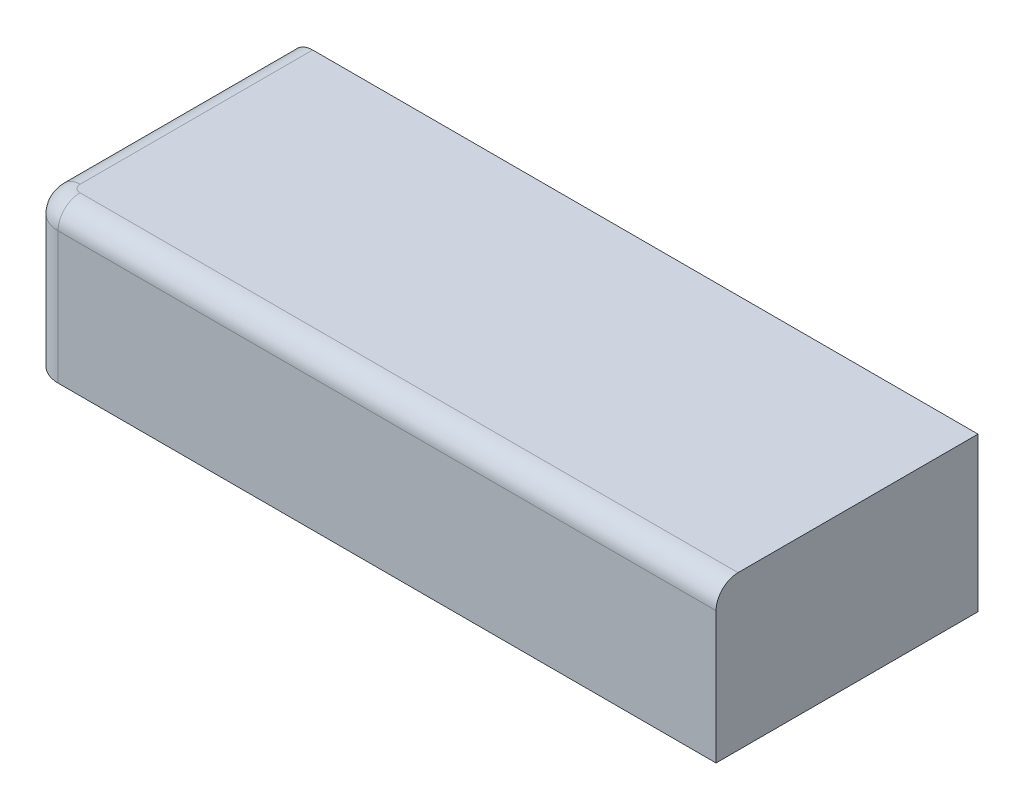
ISO-10303-21;
HEADER;
FILE_DESCRIPTION(('STEP AP214'),'2;1');
FILE_NAME('part.step','',(''),(''),'','','');
FILE_SCHEMA(('AUTOMOTIVE_DESIGN { 1 0 10303 214 1 1 1 1 }'));
ENDSEC;
DATA;
#1=APPLICATION_CONTEXT('core data for automotive mechanical design processes');
#2=APPLICATION_PROTOCOL_DEFINITION('international standard','automotive_design',2000,#1);
#3=PRODUCT_CONTEXT('',#1,'mechanical');
#4=PRODUCT('Part','Part','',(#3));
#5=PRODUCT_RELATED_PRODUCT_CATEGORY('part','',(#4));
#6=PRODUCT_DEFINITION_FORMATION('','',#4);
#7=PRODUCT_DEFINITION_CONTEXT('part definition',#1,'design');
#8=PRODUCT_DEFINITION('design','',#6,#7);
#9=PRODUCT_DEFINITION_SHAPE('','',#8);
#10=(LENGTH_UNIT() NAMED_UNIT(*) SI_UNIT(.MILLI.,.METRE.));
#11=(NAMED_UNIT(*) PLANE_ANGLE_UNIT() SI_UNIT($,.RADIAN.));
#12=(NAMED_UNIT(*) SI_UNIT($,.STERADIAN.) SOLID_ANGLE_UNIT());
#13=UNCERTAINTY_MEASURE_WITH_UNIT(LENGTH_MEASURE(1.E-05),#10,'distance_accuracy_value','');
#14=(GEOMETRIC_REPRESENTATION_CONTEXT(3) GLOBAL_UNCERTAINTY_ASSIGNED_CONTEXT((#13)) GLOBAL_UNIT_ASSIGNED_CONTEXT((#10,
#11,#12)) REPRESENTATION_CONTEXT('',''));
#15=CARTESIAN_POINT('',(0.,0.,0.));
#16=DIRECTION('',(0.,0.,1.));
#17=DIRECTION('',(1.,0.,0.));
#18=AXIS2_PLACEMENT_3D('',#15,#16,#17);
#19=CARTESIAN_POINT('',(46.9,21.,-17.875));
#20=DIRECTION('',(-1.,0.,0.));
#21=DIRECTION('',(0.,0.,1.));
#22=AXIS2_PLACEMENT_3D('',#19,#20,#21);
#23=PLANE('',#22);
#24=DIRECTION('',(0.,0.,-1.));
#25=VECTOR('',#24,1.);
#26=CARTESIAN_POINT('',(46.9,21.,-17.875));
#27=LINE('',#26,#25);
#28=CARTESIAN_POINT('',(46.9,21.,14.875));
#29=VERTEX_POINT('',#28);
#30=CARTESIAN_POINT('',(46.9,21.,-17.875));
#31=VERTEX_POINT('',#30);
#32=EDGE_CURVE('E102',#29,#31,#27,.T.);
#33=ORIENTED_EDGE('',*,*,#32,.F.);
#34=CARTESIAN_POINT('',(46.9,18.,14.875));
#35=DIRECTION('',(-1.,0.,0.));
#36=DIRECTION('',(0.,0.,1.));
#37=AXIS2_PLACEMENT_3D('',#34,#35,#36);
#38=CIRCLE('',#37,3.);
#39=CARTESIAN_POINT('',(46.9,18.,17.875));
#40=VERTEX_POINT('',#39);
#41=EDGE_CURVE('E67',#29,#40,#38,.F.);
#42=ORIENTED_EDGE('',*,*,#41,.T.);
#43=DIRECTION('',(0.,-1.,0.));
#44=VECTOR('',#43,1.);
#45=CARTESIAN_POINT('',(46.9,21.,17.875));
#46=LINE('',#45,#44);
#47=CARTESIAN_POINT('',(46.9,0.,17.875));
#48=VERTEX_POINT('',#47);
#49=EDGE_CURVE('E122',#40,#48,#46,.T.);
#50=ORIENTED_EDGE('',*,*,#49,.T.);
#51=DIRECTION('',(0.,0.,-1.));
#52=VECTOR('',#51,1.);
#53=CARTESIAN_POINT('',(46.9,0.,-17.875));
#54=LINE('',#53,#52);
#55=CARTESIAN_POINT('',(46.9,0.,-17.875));
#56=VERTEX_POINT('',#55);
#57=EDGE_CURVE('E125',#48,#56,#54,.T.);
#58=ORIENTED_EDGE('',*,*,#57,.T.);
#59=DIRECTION('',(0.,-1.,0.));
#60=VECTOR('',#59,1.);
#61=CARTESIAN_POINT('',(46.9,21.,-17.875));
#62=LINE('',#61,#60);
#63=EDGE_CURVE('E118',#31,#56,#62,.T.);
#64=ORIENTED_EDGE('',*,*,#63,.F.);
#65=EDGE_LOOP('',(#33,#42,#50,#58,#64));
#66=FACE_BOUND('',#65,.T.);
#67=ADVANCED_FACE('F43',(#66),#23,.F.);
#68=CARTESIAN_POINT('',(-46.9,21.,-17.875));
#69=DIRECTION('',(0.,0.,1.));
#70=DIRECTION('',(1.,0.,0.));
#71=AXIS2_PLACEMENT_3D('',#68,#69,#70);
#72=PLANE('',#71);
#73=DIRECTION('',(0.,-1.,0.));
#74=VECTOR('',#73,1.);
#75=CARTESIAN_POINT('',(-46.9,21.,-17.875));
#76=LINE('',#75,#74);
#77=CARTESIAN_POINT('',(-46.9,18.,-17.875));
#78=VERTEX_POINT('',#77);
#79=CARTESIAN_POINT('',(-46.9,0.,-17.875));
#80=VERTEX_POINT('',#79);
#81=EDGE_CURVE('E127',#78,#80,#76,.T.);
#82=ORIENTED_EDGE('',*,*,#81,.F.);
#83=CARTESIAN_POINT('',(-43.9,18.,-17.875));
#84=DIRECTION('',(0.,0.,1.));
#85=DIRECTION('',(1.,0.,0.));
#86=AXIS2_PLACEMENT_3D('',#83,#84,#85);
#87=CIRCLE('',#86,3.);
#88=CARTESIAN_POINT('',(-43.9,21.,-17.875));
#89=VERTEX_POINT('',#88);
#90=EDGE_CURVE('E121',#78,#89,#87,.F.);
#91=ORIENTED_EDGE('',*,*,#90,.T.);
#92=DIRECTION('',(-1.,0.,0.));
#93=VECTOR('',#92,1.);
#94=CARTESIAN_POINT('',(-46.9,21.,-17.875));
#95=LINE('',#94,#93);
#96=EDGE_CURVE('E106',#31,#89,#95,.T.);
#97=ORIENTED_EDGE('',*,*,#96,.F.);
#98=ORIENTED_EDGE('',*,*,#63,.T.);
#99=DIRECTION('',(-1.,0.,0.));
#100=VECTOR('',#99,1.);
#101=CARTESIAN_POINT('',(-46.9,0.,-17.875));
#102=LINE('',#101,#100);
#103=EDGE_CURVE('E150',#56,#80,#102,.T.);
#104=ORIENTED_EDGE('',*,*,#103,.T.);
#105=EDGE_LOOP('',(#82,#91,#97,#98,#104));
#106=FACE_BOUND('',#105,.T.);
#107=ADVANCED_FACE('F116',(#106),#72,.F.);
#108=CARTESIAN_POINT('',(-46.9,21.,-17.875));
#109=DIRECTION('',(1.,0.,0.));
#110=DIRECTION('',(0.,0.,-1.));
#111=AXIS2_PLACEMENT_3D('',#108,#109,#110);
#112=PLANE('',#111);
#113=DIRECTION('',(0.,-1.,0.));
#114=VECTOR('',#113,1.);
#115=CARTESIAN_POINT('',(-46.9,21.,13.875));
#116=LINE('',#115,#114);
#117=CARTESIAN_POINT('',(-46.9,18.,13.875));
#118=VERTEX_POINT('',#117);
#119=CARTESIAN_POINT('',(-46.9,0.,13.875));
#120=VERTEX_POINT('',#119);
#121=EDGE_CURVE('E130',#118,#120,#116,.T.);
#122=ORIENTED_EDGE('',*,*,#121,.F.);
#123=DIRECTION('',(0.,0.,1.));
#124=VECTOR('',#123,1.);
#125=CARTESIAN_POINT('',(-46.9,18.,-17.875));
#126=LINE('',#125,#124);
#127=EDGE_CURVE('E137',#118,#78,#126,.F.);
#128=ORIENTED_EDGE('',*,*,#127,.T.);
#129=ORIENTED_EDGE('',*,*,#81,.T.);
#130=DIRECTION('',(0.,0.,1.));
#131=VECTOR('',#130,1.);
#132=CARTESIAN_POINT('',(-46.9,0.,-17.875));
#133=LINE('',#132,#131);
#134=EDGE_CURVE('E152',#80,#120,#133,.T.);
#135=ORIENTED_EDGE('',*,*,#134,.T.);
#136=EDGE_LOOP('',(#122,#128,#129,#135));
#137=FACE_BOUND('',#136,.T.);
#138=ADVANCED_FACE('F171',(#137),#112,.F.);
#139=CARTESIAN_POINT('',(-42.9,21.,13.875));
#140=DIRECTION('',(0.,-1.,0.));
#141=DIRECTION('',(0.,0.,-1.));
#142=AXIS2_PLACEMENT_3D('',#139,#140,#141);
#143=CYLINDRICAL_SURFACE('',#142,4.);
#144=DIRECTION('',(0.,-1.,0.));
#145=VECTOR('',#144,1.);
#146=CARTESIAN_POINT('',(-42.8999999999999,21.,17.875));
#147=LINE('',#146,#145);
#148=CARTESIAN_POINT('',(-42.8999999999999,18.,17.875));
#149=VERTEX_POINT('',#148);
#150=CARTESIAN_POINT('',(-42.8999999999999,0.,17.875));
#151=VERTEX_POINT('',#150);
#152=EDGE_CURVE('E163',#149,#151,#147,.T.);
#153=ORIENTED_EDGE('',*,*,#152,.F.);
#154=CARTESIAN_POINT('',(-42.9,18.,13.875));
#155=DIRECTION('',(0.,1.,0.));
#156=DIRECTION('',(0.,0.,1.));
#157=AXIS2_PLACEMENT_3D('',#154,#155,#156);
#158=CIRCLE('',#157,4.);
#159=EDGE_CURVE('E11',#149,#118,#158,.F.);
#160=ORIENTED_EDGE('',*,*,#159,.T.);
#161=ORIENTED_EDGE('',*,*,#121,.T.);
#162=CARTESIAN_POINT('',(-42.9,0.,13.875));
#163=DIRECTION('',(0.,1.,0.));
#164=DIRECTION('',(0.,0.,1.));
#165=AXIS2_PLACEMENT_3D('',#162,#163,#164);
#166=CIRCLE('',#165,4.);
#167=EDGE_CURVE('E157',#120,#151,#166,.T.);
#168=ORIENTED_EDGE('',*,*,#167,.T.);
#169=EDGE_LOOP('',(#153,#160,#161,#168));
#170=FACE_BOUND('',#169,.T.);
#171=ADVANCED_FACE('F166',(#170),#143,.T.);
#172=CARTESIAN_POINT('',(-42.8999999999999,21.,17.875));
#173=DIRECTION('',(0.,0.,-1.));
#174=DIRECTION('',(-1.,0.,0.));
#175=AXIS2_PLACEMENT_3D('',#172,#173,#174);
#176=PLANE('',#175);
#177=ORIENTED_EDGE('',*,*,#49,.F.);
#178=DIRECTION('',(1.,0.,0.));
#179=VECTOR('',#178,1.);
#180=CARTESIAN_POINT('',(-42.8999999999999,18.,17.875));
#181=LINE('',#180,#179);
#182=EDGE_CURVE('E52',#40,#149,#181,.F.);
#183=ORIENTED_EDGE('',*,*,#182,.T.);
#184=ORIENTED_EDGE('',*,*,#152,.T.);
#185=DIRECTION('',(1.,0.,0.));
#186=VECTOR('',#185,1.);
#187=CARTESIAN_POINT('',(-42.8999999999999,0.,17.875));
#188=LINE('',#187,#186);
#189=EDGE_CURVE('E111',#151,#48,#188,.T.);
#190=ORIENTED_EDGE('',*,*,#189,.T.);
#191=EDGE_LOOP('',(#177,#183,#184,#190));
#192=FACE_BOUND('',#191,.T.);
#193=ADVANCED_FACE('F174',(#192),#176,.F.);
#194=CARTESIAN_POINT('',(-42.9,21.,13.875));
#195=DIRECTION('',(0.,1.,0.));
#196=DIRECTION('',(0.,0.,1.));
#197=AXIS2_PLACEMENT_3D('',#194,#195,#196);
#198=PLANE('',#197);
#199=ORIENTED_EDGE('',*,*,#96,.T.);
#200=DIRECTION('',(0.,0.,1.));
#201=VECTOR('',#200,1.);
#202=CARTESIAN_POINT('',(-43.9,21.,13.875));
#203=LINE('',#202,#201);
#204=CARTESIAN_POINT('',(-43.9,21.,13.875));
#205=VERTEX_POINT('',#204);
#206=EDGE_CURVE('E135',#89,#205,#203,.T.);
#207=ORIENTED_EDGE('',*,*,#206,.T.);
#208=CARTESIAN_POINT('',(-42.9,21.,13.875));
#209=DIRECTION('',(0.,1.,0.));
#210=DIRECTION('',(0.,0.,1.));
#211=AXIS2_PLACEMENT_3D('',#208,#209,#210);
#212=CIRCLE('',#211,0.999999999999998);
#213=CARTESIAN_POINT('',(-42.8999999999999,21.,14.875));
#214=VERTEX_POINT('',#213);
#215=EDGE_CURVE('E126',#205,#214,#212,.T.);
#216=ORIENTED_EDGE('',*,*,#215,.T.);
#217=DIRECTION('',(1.,0.,0.));
#218=VECTOR('',#217,1.);
#219=CARTESIAN_POINT('',(46.9,21.,14.875));
#220=LINE('',#219,#218);
#221=EDGE_CURVE('E109',#214,#29,#220,.T.);
#222=ORIENTED_EDGE('',*,*,#221,.T.);
#223=ORIENTED_EDGE('',*,*,#32,.T.);
#224=EDGE_LOOP('',(#199,#207,#216,#222,#223));
#225=FACE_BOUND('',#224,.T.);
#226=ADVANCED_FACE('F104',(#225),#198,.T.);
#227=CARTESIAN_POINT('',(-42.9,0.,13.875));
#228=DIRECTION('',(0.,1.,0.));
#229=DIRECTION('',(0.,0.,1.));
#230=AXIS2_PLACEMENT_3D('',#227,#228,#229);
#231=PLANE('',#230);
#232=ORIENTED_EDGE('',*,*,#57,.F.);
#233=ORIENTED_EDGE('',*,*,#189,.F.);
#234=ORIENTED_EDGE('',*,*,#167,.F.);
#235=ORIENTED_EDGE('',*,*,#134,.F.);
#236=ORIENTED_EDGE('',*,*,#103,.F.);
#237=EDGE_LOOP('',(#232,#233,#234,#235,#236));
#238=FACE_BOUND('',#237,.T.);
#239=ADVANCED_FACE('F173',(#238),#231,.F.);
#240=CARTESIAN_POINT('',(-42.9,18.,14.875));
#241=DIRECTION('',(-1.,0.,0.));
#242=DIRECTION('',(0.,0.,1.));
#243=AXIS2_PLACEMENT_3D('',#240,#241,#242);
#244=CYLINDRICAL_SURFACE('',#243,3.);
#245=ORIENTED_EDGE('',*,*,#41,.F.);
#246=ORIENTED_EDGE('',*,*,#221,.F.);
#247=CARTESIAN_POINT('',(-42.8999999999999,18.,14.875));
#248=DIRECTION('',(-1.,0.,0.));
#249=DIRECTION('',(0.,0.,1.));
#250=AXIS2_PLACEMENT_3D('',#247,#248,#249);
#251=CIRCLE('',#250,3.);
#252=EDGE_CURVE('E47',#149,#214,#251,.T.);
#253=ORIENTED_EDGE('',*,*,#252,.F.);
#254=ORIENTED_EDGE('',*,*,#182,.F.);
#255=EDGE_LOOP('',(#245,#246,#253,#254));
#256=FACE_BOUND('',#255,.T.);
#257=ADVANCED_FACE('F45',(#256),#244,.T.);
#258=CARTESIAN_POINT('',(-42.9,18.,13.875));
#259=DIRECTION('',(0.,1.,0.));
#260=DIRECTION('',(0.,0.,1.));
#261=AXIS2_PLACEMENT_3D('',#258,#259,#260);
#262=DEGENERATE_TOROIDAL_SURFACE('',#261,0.999999999999998,3.,.T.);
#263=ORIENTED_EDGE('',*,*,#252,.T.);
#264=ORIENTED_EDGE('',*,*,#215,.F.);
#265=CARTESIAN_POINT('',(-43.9,18.,13.875));
#266=DIRECTION('',(0.,0.,-1.));
#267=DIRECTION('',(-1.,0.,0.));
#268=AXIS2_PLACEMENT_3D('',#265,#266,#267);
#269=CIRCLE('',#268,3.);
#270=EDGE_CURVE('E141',#118,#205,#269,.T.);
#271=ORIENTED_EDGE('',*,*,#270,.F.);
#272=ORIENTED_EDGE('',*,*,#159,.F.);
#273=EDGE_LOOP('',(#263,#264,#271,#272));
#274=FACE_BOUND('',#273,.T.);
#275=ADVANCED_FACE('F176',(#274),#262,.T.);
#276=CARTESIAN_POINT('',(-43.9,18.,13.875));
#277=DIRECTION('',(0.,0.,-1.));
#278=DIRECTION('',(-1.,0.,0.));
#279=AXIS2_PLACEMENT_3D('',#276,#277,#278);
#280=CYLINDRICAL_SURFACE('',#279,3.);
#281=ORIENTED_EDGE('',*,*,#90,.F.);
#282=ORIENTED_EDGE('',*,*,#127,.F.);
#283=ORIENTED_EDGE('',*,*,#270,.T.);
#284=ORIENTED_EDGE('',*,*,#206,.F.);
#285=EDGE_LOOP('',(#281,#282,#283,#284));
#286=FACE_BOUND('',#285,.T.);
#287=ADVANCED_FACE('F177',(#286),#280,.T.);
#288=CLOSED_SHELL('',(#67,#107,#138,#171,#193,#226,#239,#257,#275,#287));
#289=MANIFOLD_SOLID_BREP('B2',#288);
#290=ADVANCED_BREP_SHAPE_REPRESENTATION('',(#18,#289),#14);
#291=SHAPE_DEFINITION_REPRESENTATION(#9,#290);
ENDSEC;
END-ISO-10303-21;
